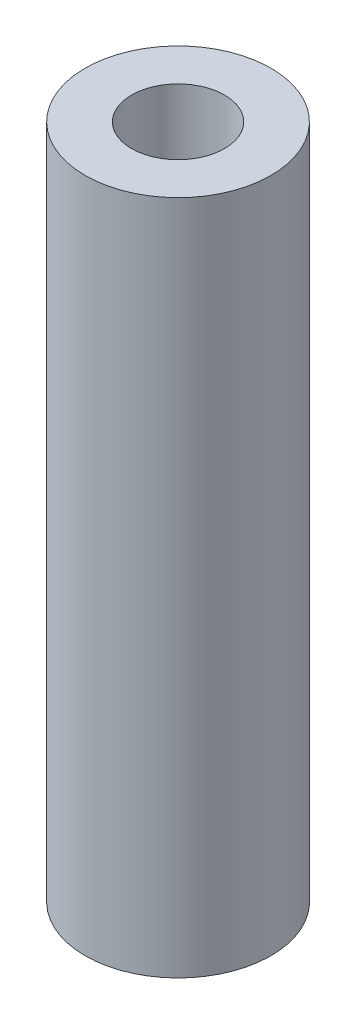
ISO-10303-21;
HEADER;
FILE_DESCRIPTION(('STEP AP214'),'2;1');
FILE_NAME('part.step','',(''),(''),'','','');
FILE_SCHEMA(('AUTOMOTIVE_DESIGN { 1 0 10303 214 1 1 1 1 }'));
ENDSEC;
DATA;
#1=APPLICATION_CONTEXT('core data for automotive mechanical design processes');
#2=APPLICATION_PROTOCOL_DEFINITION('international standard','automotive_design',2000,#1);
#3=PRODUCT_CONTEXT('',#1,'mechanical');
#4=PRODUCT('Part','Part','',(#3));
#5=PRODUCT_RELATED_PRODUCT_CATEGORY('part','',(#4));
#6=PRODUCT_DEFINITION_FORMATION('','',#4);
#7=PRODUCT_DEFINITION_CONTEXT('part definition',#1,'design');
#8=PRODUCT_DEFINITION('design','',#6,#7);
#9=PRODUCT_DEFINITION_SHAPE('','',#8);
#10=(LENGTH_UNIT() NAMED_UNIT(*) SI_UNIT(.MILLI.,.METRE.));
#11=(NAMED_UNIT(*) PLANE_ANGLE_UNIT() SI_UNIT($,.RADIAN.));
#12=(NAMED_UNIT(*) SI_UNIT($,.STERADIAN.) SOLID_ANGLE_UNIT());
#13=UNCERTAINTY_MEASURE_WITH_UNIT(LENGTH_MEASURE(1.E-05),#10,'distance_accuracy_value','');
#14=(GEOMETRIC_REPRESENTATION_CONTEXT(3) GLOBAL_UNCERTAINTY_ASSIGNED_CONTEXT((#13)) GLOBAL_UNIT_ASSIGNED_CONTEXT((#10,
#11,#12)) REPRESENTATION_CONTEXT('',''));
#15=CARTESIAN_POINT('',(0.,0.,0.));
#16=DIRECTION('',(0.,0.,1.));
#17=DIRECTION('',(1.,0.,0.));
#18=AXIS2_PLACEMENT_3D('',#15,#16,#17);
#19=CARTESIAN_POINT('',(0.,80.,0.));
#20=DIRECTION('',(0.,-1.,0.));
#21=DIRECTION('',(0.,0.,-1.));
#22=AXIS2_PLACEMENT_3D('',#19,#20,#21);
#23=CYLINDRICAL_SURFACE('',#22,11.);
#24=CARTESIAN_POINT('',(0.,80.,0.));
#25=DIRECTION('',(0.,1.,0.));
#26=DIRECTION('',(0.,0.,1.));
#27=AXIS2_PLACEMENT_3D('',#24,#25,#26);
#28=CIRCLE('',#27,11.);
#29=CARTESIAN_POINT('',(0.,80.,11.));
#30=VERTEX_POINT('',#29);
#31=EDGE_CURVE('E10',#30,#30,#28,.T.);
#32=ORIENTED_EDGE('',*,*,#31,.F.);
#33=EDGE_LOOP('',(#32));
#34=FACE_BOUND('',#33,.T.);
#35=CARTESIAN_POINT('',(0.,0.,0.));
#36=DIRECTION('',(0.,1.,0.));
#37=DIRECTION('',(0.,0.,1.));
#38=AXIS2_PLACEMENT_3D('',#35,#36,#37);
#39=CIRCLE('',#38,11.);
#40=CARTESIAN_POINT('',(0.,0.,11.));
#41=VERTEX_POINT('',#40);
#42=EDGE_CURVE('E38',#41,#41,#39,.T.);
#43=ORIENTED_EDGE('',*,*,#42,.T.);
#44=EDGE_LOOP('',(#43));
#45=FACE_BOUND('',#44,.T.);
#46=ADVANCED_FACE('F35',(#34,#45),#23,.T.);
#47=CARTESIAN_POINT('',(0.,80.,0.));
#48=DIRECTION('',(0.,1.,0.));
#49=DIRECTION('',(0.,0.,1.));
#50=AXIS2_PLACEMENT_3D('',#47,#48,#49);
#51=PLANE('',#50);
#52=CARTESIAN_POINT('',(0.,80.,0.));
#53=DIRECTION('',(0.,1.,0.));
#54=DIRECTION('',(0.,0.,1.));
#55=AXIS2_PLACEMENT_3D('',#52,#53,#54);
#56=CIRCLE('',#55,5.5);
#57=CARTESIAN_POINT('',(0.,80.,5.5));
#58=VERTEX_POINT('',#57);
#59=EDGE_CURVE('E49',#58,#58,#56,.T.);
#60=ORIENTED_EDGE('',*,*,#59,.F.);
#61=EDGE_LOOP('',(#60));
#62=FACE_BOUND('',#61,.T.);
#63=ORIENTED_EDGE('',*,*,#31,.T.);
#64=EDGE_LOOP('',(#63));
#65=FACE_BOUND('',#64,.T.);
#66=ADVANCED_FACE('F56',(#62,#65),#51,.T.);
#67=CARTESIAN_POINT('',(0.,0.,0.));
#68=DIRECTION('',(0.,1.,0.));
#69=DIRECTION('',(0.,0.,1.));
#70=AXIS2_PLACEMENT_3D('',#67,#68,#69);
#71=PLANE('',#70);
#72=CARTESIAN_POINT('',(0.,0.,0.));
#73=DIRECTION('',(0.,1.,0.));
#74=DIRECTION('',(0.,0.,1.));
#75=AXIS2_PLACEMENT_3D('',#72,#73,#74);
#76=CIRCLE('',#75,5.5);
#77=CARTESIAN_POINT('',(0.,0.,5.5));
#78=VERTEX_POINT('',#77);
#79=EDGE_CURVE('E45',#78,#78,#76,.F.);
#80=ORIENTED_EDGE('',*,*,#79,.F.);
#81=EDGE_LOOP('',(#80));
#82=FACE_BOUND('',#81,.T.);
#83=ORIENTED_EDGE('',*,*,#42,.F.);
#84=EDGE_LOOP('',(#83));
#85=FACE_BOUND('',#84,.T.);
#86=ADVANCED_FACE('F58',(#82,#85),#71,.F.);
#87=CARTESIAN_POINT('',(0.,-0.001000000000001,0.));
#88=DIRECTION('',(0.,1.,0.));
#89=DIRECTION('',(0.,0.,1.));
#90=AXIS2_PLACEMENT_3D('',#87,#88,#89);
#91=CYLINDRICAL_SURFACE('',#90,5.5);
#92=ORIENTED_EDGE('',*,*,#59,.T.);
#93=EDGE_LOOP('',(#92));
#94=FACE_BOUND('',#93,.T.);
#95=ORIENTED_EDGE('',*,*,#79,.T.);
#96=EDGE_LOOP('',(#95));
#97=FACE_BOUND('',#96,.T.);
#98=ADVANCED_FACE('F53',(#94,#97),#91,.F.);
#99=CLOSED_SHELL('',(#46,#66,#86,#98));
#100=MANIFOLD_SOLID_BREP('B2',#99);
#101=ADVANCED_BREP_SHAPE_REPRESENTATION('',(#18,#100),#14);
#102=SHAPE_DEFINITION_REPRESENTATION(#9,#101);
ENDSEC;
END-ISO-10303-21;
